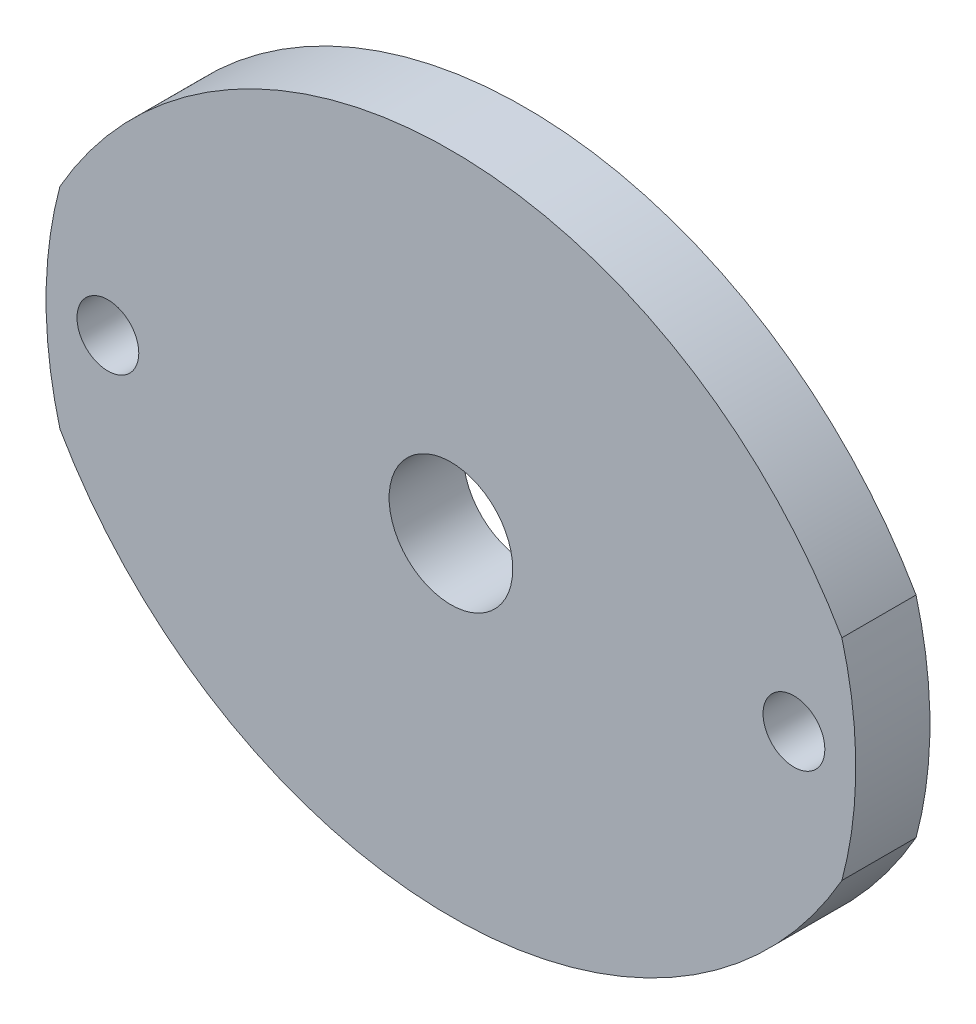
ISO-10303-21;
HEADER;
FILE_DESCRIPTION(('STEP AP214'),'2;1');
FILE_NAME('part.step','',(''),(''),'','','');
FILE_SCHEMA(('AUTOMOTIVE_DESIGN { 1 0 10303 214 1 1 1 1 }'));
ENDSEC;
DATA;
#1=APPLICATION_CONTEXT('core data for automotive mechanical design processes');
#2=APPLICATION_PROTOCOL_DEFINITION('international standard','automotive_design',2000,#1);
#3=PRODUCT_CONTEXT('',#1,'mechanical');
#4=PRODUCT('Part','Part','',(#3));
#5=PRODUCT_RELATED_PRODUCT_CATEGORY('part','',(#4));
#6=PRODUCT_DEFINITION_FORMATION('','',#4);
#7=PRODUCT_DEFINITION_CONTEXT('part definition',#1,'design');
#8=PRODUCT_DEFINITION('design','',#6,#7);
#9=PRODUCT_DEFINITION_SHAPE('','',#8);
#10=(LENGTH_UNIT() NAMED_UNIT(*) SI_UNIT(.MILLI.,.METRE.));
#11=(NAMED_UNIT(*) PLANE_ANGLE_UNIT() SI_UNIT($,.RADIAN.));
#12=(NAMED_UNIT(*) SI_UNIT($,.STERADIAN.) SOLID_ANGLE_UNIT());
#13=UNCERTAINTY_MEASURE_WITH_UNIT(LENGTH_MEASURE(1.E-05),#10,'distance_accuracy_value','');
#14=(GEOMETRIC_REPRESENTATION_CONTEXT(3) GLOBAL_UNCERTAINTY_ASSIGNED_CONTEXT((#13)) GLOBAL_UNIT_ASSIGNED_CONTEXT((#10,
#11,#12)) REPRESENTATION_CONTEXT('',''));
#15=CARTESIAN_POINT('',(0.,0.,0.));
#16=DIRECTION('',(0.,0.,1.));
#17=DIRECTION('',(1.,0.,0.));
#18=AXIS2_PLACEMENT_3D('',#15,#16,#17);
#19=CARTESIAN_POINT('',(11.2572255309377,303.477796840178,3.));
#20=DIRECTION('',(0.,0.,1.));
#21=DIRECTION('',(1.,0.,0.));
#22=AXIS2_PLACEMENT_3D('',#19,#20,#21);
#23=PLANE('',#22);
#24=CARTESIAN_POINT('',(25.1322255309377,305.873196915984,3.));
#25=DIRECTION('',(0.,0.,1.));
#26=DIRECTION('',(1.,0.,0.));
#27=AXIS2_PLACEMENT_3D('',#24,#25,#26);
#28=CIRCLE('',#27,1.25);
#29=CARTESIAN_POINT('',(26.3822255309377,305.873196915984,3.));
#30=VERTEX_POINT('',#29);
#31=EDGE_CURVE('E114',#30,#30,#28,.T.);
#32=ORIENTED_EDGE('',*,*,#31,.F.);
#33=EDGE_LOOP('',(#32));
#34=FACE_BOUND('',#33,.T.);
#35=CARTESIAN_POINT('',(11.2572255309377,301.082396764372,3.));
#36=DIRECTION('',(0.,0.,1.));
#37=DIRECTION('',(1.,0.,0.));
#38=AXIS2_PLACEMENT_3D('',#35,#36,#37);
#39=CIRCLE('',#38,18.2158001516126);
#40=CARTESIAN_POINT('',(27.0710509921827,310.123320359048,3.));
#41=VERTEX_POINT('',#40);
#42=CARTESIAN_POINT('',(-4.55659993030735,310.123320359048,3.));
#43=VERTEX_POINT('',#42);
#44=EDGE_CURVE('E84',#41,#43,#39,.T.);
#45=ORIENTED_EDGE('',*,*,#44,.T.);
#46=CARTESIAN_POINT('',(11.2572255309377,305.873196915984,3.));
#47=DIRECTION('',(0.,0.,1.));
#48=DIRECTION('',(1.,0.,0.));
#49=AXIS2_PLACEMENT_3D('',#46,#47,#48);
#50=CIRCLE('',#49,16.375);
#51=CARTESIAN_POINT('',(-4.55659993030749,301.623073472921,3.));
#52=VERTEX_POINT('',#51);
#53=EDGE_CURVE('E79',#43,#52,#50,.T.);
#54=ORIENTED_EDGE('',*,*,#53,.T.);
#55=CARTESIAN_POINT('',(11.2572255309377,310.663997067597,3.));
#56=DIRECTION('',(0.,0.,1.));
#57=DIRECTION('',(1.,0.,0.));
#58=AXIS2_PLACEMENT_3D('',#55,#56,#57);
#59=CIRCLE('',#58,18.2158001516126);
#60=CARTESIAN_POINT('',(27.071050992183,301.623073472921,3.));
#61=VERTEX_POINT('',#60);
#62=EDGE_CURVE('E82',#52,#61,#59,.T.);
#63=ORIENTED_EDGE('',*,*,#62,.T.);
#64=CARTESIAN_POINT('',(11.2572255309377,305.873196915984,3.));
#65=DIRECTION('',(0.,0.,1.));
#66=DIRECTION('',(1.,0.,0.));
#67=AXIS2_PLACEMENT_3D('',#64,#65,#66);
#68=CIRCLE('',#67,16.375);
#69=EDGE_CURVE('E49',#61,#41,#68,.T.);
#70=ORIENTED_EDGE('',*,*,#69,.T.);
#71=EDGE_LOOP('',(#45,#54,#63,#70));
#72=FACE_BOUND('',#71,.T.);
#73=CARTESIAN_POINT('',(11.2572255309377,305.873196915984,3.));
#74=DIRECTION('',(0.,0.,1.));
#75=DIRECTION('',(1.,0.,0.));
#76=AXIS2_PLACEMENT_3D('',#73,#74,#75);
#77=CIRCLE('',#76,2.5);
#78=CARTESIAN_POINT('',(13.7572255309377,305.873196915984,3.));
#79=VERTEX_POINT('',#78);
#80=EDGE_CURVE('E99',#79,#79,#77,.T.);
#81=ORIENTED_EDGE('',*,*,#80,.F.);
#82=EDGE_LOOP('',(#81));
#83=FACE_BOUND('',#82,.T.);
#84=CARTESIAN_POINT('',(-2.61777446906231,305.873196915984,3.));
#85=DIRECTION('',(0.,0.,1.));
#86=DIRECTION('',(1.,0.,0.));
#87=AXIS2_PLACEMENT_3D('',#84,#85,#86);
#88=CIRCLE('',#87,1.25);
#89=CARTESIAN_POINT('',(-1.36777446906231,305.873196915984,3.));
#90=VERTEX_POINT('',#89);
#91=EDGE_CURVE('E120',#90,#90,#88,.T.);
#92=ORIENTED_EDGE('',*,*,#91,.F.);
#93=EDGE_LOOP('',(#92));
#94=FACE_BOUND('',#93,.T.);
#95=ADVANCED_FACE('F32',(#34,#72,#83,#94),#23,.T.);
#96=CARTESIAN_POINT('',(11.2572255309377,303.477796840178,0.));
#97=DIRECTION('',(0.,0.,1.));
#98=DIRECTION('',(1.,0.,0.));
#99=AXIS2_PLACEMENT_3D('',#96,#97,#98);
#100=PLANE('',#99);
#101=CARTESIAN_POINT('',(11.2572255309377,301.082396764372,0.));
#102=DIRECTION('',(0.,0.,1.));
#103=DIRECTION('',(1.,0.,0.));
#104=AXIS2_PLACEMENT_3D('',#101,#102,#103);
#105=CIRCLE('',#104,18.2158001516126);
#106=CARTESIAN_POINT('',(27.0710509921827,310.123320359048,0.));
#107=VERTEX_POINT('',#106);
#108=CARTESIAN_POINT('',(-4.55659993030735,310.123320359048,0.));
#109=VERTEX_POINT('',#108);
#110=EDGE_CURVE('E96',#107,#109,#105,.T.);
#111=ORIENTED_EDGE('',*,*,#110,.F.);
#112=CARTESIAN_POINT('',(11.2572255309377,305.873196915984,0.));
#113=DIRECTION('',(0.,0.,1.));
#114=DIRECTION('',(1.,0.,0.));
#115=AXIS2_PLACEMENT_3D('',#112,#113,#114);
#116=CIRCLE('',#115,16.375);
#117=CARTESIAN_POINT('',(27.071050992183,301.623073472921,0.));
#118=VERTEX_POINT('',#117);
#119=EDGE_CURVE('E72',#118,#107,#116,.T.);
#120=ORIENTED_EDGE('',*,*,#119,.F.);
#121=CARTESIAN_POINT('',(11.2572255309377,310.663997067597,0.));
#122=DIRECTION('',(0.,0.,1.));
#123=DIRECTION('',(1.,0.,0.));
#124=AXIS2_PLACEMENT_3D('',#121,#122,#123);
#125=CIRCLE('',#124,18.2158001516126);
#126=CARTESIAN_POINT('',(-4.55659993030749,301.623073472921,0.));
#127=VERTEX_POINT('',#126);
#128=EDGE_CURVE('E66',#127,#118,#125,.T.);
#129=ORIENTED_EDGE('',*,*,#128,.F.);
#130=CARTESIAN_POINT('',(11.2572255309377,305.873196915984,0.));
#131=DIRECTION('',(0.,0.,1.));
#132=DIRECTION('',(1.,0.,0.));
#133=AXIS2_PLACEMENT_3D('',#130,#131,#132);
#134=CIRCLE('',#133,16.375);
#135=EDGE_CURVE('E88',#109,#127,#134,.T.);
#136=ORIENTED_EDGE('',*,*,#135,.F.);
#137=EDGE_LOOP('',(#111,#120,#129,#136));
#138=FACE_BOUND('',#137,.T.);
#139=CARTESIAN_POINT('',(11.2572255309377,305.873196915984,0.));
#140=DIRECTION('',(0.,0.,1.));
#141=DIRECTION('',(1.,0.,0.));
#142=AXIS2_PLACEMENT_3D('',#139,#140,#141);
#143=CIRCLE('',#142,2.5);
#144=CARTESIAN_POINT('',(13.7572255309377,305.873196915984,0.));
#145=VERTEX_POINT('',#144);
#146=EDGE_CURVE('E111',#145,#145,#143,.T.);
#147=ORIENTED_EDGE('',*,*,#146,.T.);
#148=EDGE_LOOP('',(#147));
#149=FACE_BOUND('',#148,.T.);
#150=CARTESIAN_POINT('',(25.1322255309377,305.873196915984,0.));
#151=DIRECTION('',(0.,0.,1.));
#152=DIRECTION('',(1.,0.,0.));
#153=AXIS2_PLACEMENT_3D('',#150,#151,#152);
#154=CIRCLE('',#153,1.25);
#155=CARTESIAN_POINT('',(26.3822255309377,305.873196915984,0.));
#156=VERTEX_POINT('',#155);
#157=EDGE_CURVE('E117',#156,#156,#154,.T.);
#158=ORIENTED_EDGE('',*,*,#157,.T.);
#159=EDGE_LOOP('',(#158));
#160=FACE_BOUND('',#159,.T.);
#161=CARTESIAN_POINT('',(-2.61777446906231,305.873196915984,0.));
#162=DIRECTION('',(0.,0.,1.));
#163=DIRECTION('',(1.,0.,0.));
#164=AXIS2_PLACEMENT_3D('',#161,#162,#163);
#165=CIRCLE('',#164,1.25);
#166=CARTESIAN_POINT('',(-1.36777446906231,305.873196915984,0.));
#167=VERTEX_POINT('',#166);
#168=EDGE_CURVE('E123',#167,#167,#165,.T.);
#169=ORIENTED_EDGE('',*,*,#168,.T.);
#170=EDGE_LOOP('',(#169));
#171=FACE_BOUND('',#170,.T.);
#172=ADVANCED_FACE('F107',(#138,#149,#160,#171),#100,.F.);
#173=CARTESIAN_POINT('',(11.2572255309377,301.082396764372,3.));
#174=DIRECTION('',(0.,0.,-1.));
#175=DIRECTION('',(-1.,0.,0.));
#176=AXIS2_PLACEMENT_3D('',#173,#174,#175);
#177=CYLINDRICAL_SURFACE('',#176,18.2158001516126);
#178=ORIENTED_EDGE('',*,*,#110,.T.);
#179=DIRECTION('',(0.,0.,-1.));
#180=VECTOR('',#179,1.);
#181=CARTESIAN_POINT('',(-4.55659993030735,310.123320359048,3.));
#182=LINE('',#181,#180);
#183=EDGE_CURVE('E11',#43,#109,#182,.T.);
#184=ORIENTED_EDGE('',*,*,#183,.F.);
#185=ORIENTED_EDGE('',*,*,#44,.F.);
#186=DIRECTION('',(0.,0.,-1.));
#187=VECTOR('',#186,1.);
#188=CARTESIAN_POINT('',(27.0710509921827,310.123320359048,3.));
#189=LINE('',#188,#187);
#190=EDGE_CURVE('E92',#41,#107,#189,.T.);
#191=ORIENTED_EDGE('',*,*,#190,.T.);
#192=EDGE_LOOP('',(#178,#184,#185,#191));
#193=FACE_BOUND('',#192,.T.);
#194=ADVANCED_FACE('F34',(#193),#177,.T.);
#195=CARTESIAN_POINT('',(11.2572255309377,305.873196915984,3.));
#196=DIRECTION('',(0.,0.,-1.));
#197=DIRECTION('',(-1.,0.,0.));
#198=AXIS2_PLACEMENT_3D('',#195,#196,#197);
#199=CYLINDRICAL_SURFACE('',#198,16.375);
#200=ORIENTED_EDGE('',*,*,#135,.T.);
#201=DIRECTION('',(0.,0.,-1.));
#202=VECTOR('',#201,1.);
#203=CARTESIAN_POINT('',(-4.55659993030749,301.623073472921,3.));
#204=LINE('',#203,#202);
#205=EDGE_CURVE('E41',#52,#127,#204,.T.);
#206=ORIENTED_EDGE('',*,*,#205,.F.);
#207=ORIENTED_EDGE('',*,*,#53,.F.);
#208=ORIENTED_EDGE('',*,*,#183,.T.);
#209=EDGE_LOOP('',(#200,#206,#207,#208));
#210=FACE_BOUND('',#209,.T.);
#211=ADVANCED_FACE('F87',(#210),#199,.T.);
#212=CARTESIAN_POINT('',(11.2572255309377,310.663997067597,3.));
#213=DIRECTION('',(0.,0.,-1.));
#214=DIRECTION('',(-1.,0.,0.));
#215=AXIS2_PLACEMENT_3D('',#212,#213,#214);
#216=CYLINDRICAL_SURFACE('',#215,18.2158001516126);
#217=ORIENTED_EDGE('',*,*,#128,.T.);
#218=DIRECTION('',(0.,0.,-1.));
#219=VECTOR('',#218,1.);
#220=CARTESIAN_POINT('',(27.071050992183,301.623073472921,3.));
#221=LINE('',#220,#219);
#222=EDGE_CURVE('E89',#61,#118,#221,.T.);
#223=ORIENTED_EDGE('',*,*,#222,.F.);
#224=ORIENTED_EDGE('',*,*,#62,.F.);
#225=ORIENTED_EDGE('',*,*,#205,.T.);
#226=EDGE_LOOP('',(#217,#223,#224,#225));
#227=FACE_BOUND('',#226,.T.);
#228=ADVANCED_FACE('F90',(#227),#216,.T.);
#229=CARTESIAN_POINT('',(11.2572255309377,305.873196915984,3.));
#230=DIRECTION('',(0.,0.,-1.));
#231=DIRECTION('',(-1.,0.,0.));
#232=AXIS2_PLACEMENT_3D('',#229,#230,#231);
#233=CYLINDRICAL_SURFACE('',#232,16.375);
#234=ORIENTED_EDGE('',*,*,#119,.T.);
#235=ORIENTED_EDGE('',*,*,#190,.F.);
#236=ORIENTED_EDGE('',*,*,#69,.F.);
#237=ORIENTED_EDGE('',*,*,#222,.T.);
#238=EDGE_LOOP('',(#234,#235,#236,#237));
#239=FACE_BOUND('',#238,.T.);
#240=ADVANCED_FACE('F104',(#239),#233,.T.);
#241=CARTESIAN_POINT('',(11.2572255309377,305.873196915984,3.));
#242=DIRECTION('',(0.,0.,-1.));
#243=DIRECTION('',(-1.,0.,0.));
#244=AXIS2_PLACEMENT_3D('',#241,#242,#243);
#245=CYLINDRICAL_SURFACE('',#244,2.5);
#246=ORIENTED_EDGE('',*,*,#80,.T.);
#247=EDGE_LOOP('',(#246));
#248=FACE_BOUND('',#247,.T.);
#249=ORIENTED_EDGE('',*,*,#146,.F.);
#250=EDGE_LOOP('',(#249));
#251=FACE_BOUND('',#250,.T.);
#252=ADVANCED_FACE('F141',(#248,#251),#245,.F.);
#253=CARTESIAN_POINT('',(25.1322255309377,305.873196915984,3.));
#254=DIRECTION('',(0.,0.,-1.));
#255=DIRECTION('',(-1.,0.,0.));
#256=AXIS2_PLACEMENT_3D('',#253,#254,#255);
#257=CYLINDRICAL_SURFACE('',#256,1.25);
#258=ORIENTED_EDGE('',*,*,#31,.T.);
#259=EDGE_LOOP('',(#258));
#260=FACE_BOUND('',#259,.T.);
#261=ORIENTED_EDGE('',*,*,#157,.F.);
#262=EDGE_LOOP('',(#261));
#263=FACE_BOUND('',#262,.T.);
#264=ADVANCED_FACE('F187',(#260,#263),#257,.F.);
#265=CARTESIAN_POINT('',(-2.61777446906231,305.873196915984,3.));
#266=DIRECTION('',(0.,0.,-1.));
#267=DIRECTION('',(-1.,0.,0.));
#268=AXIS2_PLACEMENT_3D('',#265,#266,#267);
#269=CYLINDRICAL_SURFACE('',#268,1.25);
#270=ORIENTED_EDGE('',*,*,#91,.T.);
#271=EDGE_LOOP('',(#270));
#272=FACE_BOUND('',#271,.T.);
#273=ORIENTED_EDGE('',*,*,#168,.F.);
#274=EDGE_LOOP('',(#273));
#275=FACE_BOUND('',#274,.T.);
#276=ADVANCED_FACE('F129',(#272,#275),#269,.F.);
#277=CLOSED_SHELL('',(#95,#172,#194,#211,#228,#240,#252,#264,#276));
#278=MANIFOLD_SOLID_BREP('B2',#277);
#279=ADVANCED_BREP_SHAPE_REPRESENTATION('',(#18,#278),#14);
#280=SHAPE_DEFINITION_REPRESENTATION(#9,#279);
ENDSEC;
END-ISO-10303-21;
